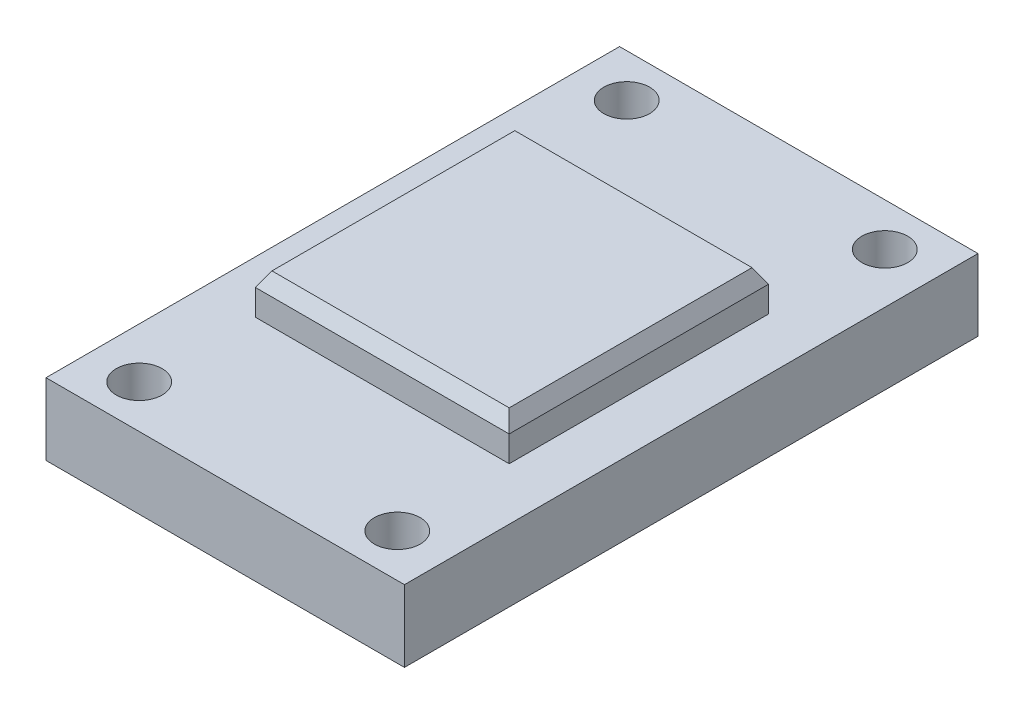
ISO-10303-21;
HEADER;
FILE_DESCRIPTION(('STEP AP214'),'2;1');
FILE_NAME('part.step','',(''),(''),'','','');
FILE_SCHEMA(('AUTOMOTIVE_DESIGN { 1 0 10303 214 1 1 1 1 }'));
ENDSEC;
DATA;
#1=APPLICATION_CONTEXT('core data for automotive mechanical design processes');
#2=APPLICATION_PROTOCOL_DEFINITION('international standard','automotive_design',2000,#1);
#3=PRODUCT_CONTEXT('',#1,'mechanical');
#4=PRODUCT('Part','Part','',(#3));
#5=PRODUCT_RELATED_PRODUCT_CATEGORY('part','',(#4));
#6=PRODUCT_DEFINITION_FORMATION('','',#4);
#7=PRODUCT_DEFINITION_CONTEXT('part definition',#1,'design');
#8=PRODUCT_DEFINITION('design','',#6,#7);
#9=PRODUCT_DEFINITION_SHAPE('','',#8);
#10=(LENGTH_UNIT() NAMED_UNIT(*) SI_UNIT(.MILLI.,.METRE.));
#11=(NAMED_UNIT(*) PLANE_ANGLE_UNIT() SI_UNIT($,.RADIAN.));
#12=(NAMED_UNIT(*) SI_UNIT($,.STERADIAN.) SOLID_ANGLE_UNIT());
#13=UNCERTAINTY_MEASURE_WITH_UNIT(LENGTH_MEASURE(1.E-05),#10,'distance_accuracy_value','');
#14=(GEOMETRIC_REPRESENTATION_CONTEXT(3) GLOBAL_UNCERTAINTY_ASSIGNED_CONTEXT((#13)) GLOBAL_UNIT_ASSIGNED_CONTEXT((#10,
#11,#12)) REPRESENTATION_CONTEXT('',''));
#15=CARTESIAN_POINT('',(0.,0.,0.));
#16=DIRECTION('',(0.,0.,1.));
#17=DIRECTION('',(1.,0.,0.));
#18=AXIS2_PLACEMENT_3D('',#15,#16,#17);
#19=CARTESIAN_POINT('',(0.,5.,0.));
#20=DIRECTION('',(0.,1.,0.));
#21=DIRECTION('',(0.,0.,1.));
#22=AXIS2_PLACEMENT_3D('',#19,#20,#21);
#23=PLANE('',#22);
#24=CARTESIAN_POINT('',(-9.,5.,17.));
#25=DIRECTION('',(0.,1.,0.));
#26=DIRECTION('',(0.,0.,1.));
#27=AXIS2_PLACEMENT_3D('',#24,#25,#26);
#28=CIRCLE('',#27,1.6);
#29=CARTESIAN_POINT('',(-9.,5.,18.6));
#30=VERTEX_POINT('',#29);
#31=EDGE_CURVE('E214',#30,#30,#28,.T.);
#32=ORIENTED_EDGE('',*,*,#31,.F.);
#33=EDGE_LOOP('',(#32));
#34=FACE_BOUND('',#33,.T.);
#35=CARTESIAN_POINT('',(-9.,5.,-17.));
#36=DIRECTION('',(0.,1.,0.));
#37=DIRECTION('',(0.,0.,1.));
#38=AXIS2_PLACEMENT_3D('',#35,#36,#37);
#39=CIRCLE('',#38,1.6);
#40=CARTESIAN_POINT('',(-9.,5.,-15.4));
#41=VERTEX_POINT('',#40);
#42=EDGE_CURVE('E211',#41,#41,#39,.T.);
#43=ORIENTED_EDGE('',*,*,#42,.F.);
#44=EDGE_LOOP('',(#43));
#45=FACE_BOUND('',#44,.T.);
#46=CARTESIAN_POINT('',(8.99999999999999,5.,-17.));
#47=DIRECTION('',(0.,1.,0.));
#48=DIRECTION('',(0.,0.,1.));
#49=AXIS2_PLACEMENT_3D('',#46,#47,#48);
#50=CIRCLE('',#49,1.6);
#51=CARTESIAN_POINT('',(8.99999999999999,5.,-15.4));
#52=VERTEX_POINT('',#51);
#53=EDGE_CURVE('E208',#52,#52,#50,.T.);
#54=ORIENTED_EDGE('',*,*,#53,.F.);
#55=EDGE_LOOP('',(#54));
#56=FACE_BOUND('',#55,.T.);
#57=CARTESIAN_POINT('',(9.,5.,17.));
#58=DIRECTION('',(0.,1.,0.));
#59=DIRECTION('',(0.,0.,1.));
#60=AXIS2_PLACEMENT_3D('',#57,#58,#59);
#61=CIRCLE('',#60,1.6);
#62=CARTESIAN_POINT('',(9.,5.,18.6));
#63=VERTEX_POINT('',#62);
#64=EDGE_CURVE('E126',#63,#63,#61,.T.);
#65=ORIENTED_EDGE('',*,*,#64,.F.);
#66=EDGE_LOOP('',(#65));
#67=FACE_BOUND('',#66,.T.);
#68=DIRECTION('',(0.,0.,1.));
#69=VECTOR('',#68,1.);
#70=CARTESIAN_POINT('',(-12.5,5.,20.));
#71=LINE('',#70,#69);
#72=CARTESIAN_POINT('',(-12.5,5.,-20.));
#73=VERTEX_POINT('',#72);
#74=CARTESIAN_POINT('',(-12.5,5.,20.));
#75=VERTEX_POINT('',#74);
#76=EDGE_CURVE('E140',#73,#75,#71,.T.);
#77=ORIENTED_EDGE('',*,*,#76,.T.);
#78=DIRECTION('',(1.,0.,0.));
#79=VECTOR('',#78,1.);
#80=CARTESIAN_POINT('',(12.5,5.,20.));
#81=LINE('',#80,#79);
#82=CARTESIAN_POINT('',(12.5,5.,20.));
#83=VERTEX_POINT('',#82);
#84=EDGE_CURVE('E143',#75,#83,#81,.T.);
#85=ORIENTED_EDGE('',*,*,#84,.T.);
#86=DIRECTION('',(0.,0.,-1.));
#87=VECTOR('',#86,1.);
#88=CARTESIAN_POINT('',(12.5,5.,20.));
#89=LINE('',#88,#87);
#90=CARTESIAN_POINT('',(12.5,5.,-20.));
#91=VERTEX_POINT('',#90);
#92=EDGE_CURVE('E146',#83,#91,#89,.T.);
#93=ORIENTED_EDGE('',*,*,#92,.T.);
#94=DIRECTION('',(-1.,0.,0.));
#95=VECTOR('',#94,1.);
#96=CARTESIAN_POINT('',(12.5,5.,-20.));
#97=LINE('',#96,#95);
#98=EDGE_CURVE('E148',#91,#73,#97,.T.);
#99=ORIENTED_EDGE('',*,*,#98,.T.);
#100=EDGE_LOOP('',(#77,#85,#93,#99));
#101=FACE_BOUND('',#100,.T.);
#102=DIRECTION('',(1.,0.,0.));
#103=VECTOR('',#102,1.);
#104=CARTESIAN_POINT('',(8.85,5.,9.04633934668198));
#105=LINE('',#104,#103);
#106=CARTESIAN_POINT('',(-8.84999999999999,5.,9.04633934668198));
#107=VERTEX_POINT('',#106);
#108=CARTESIAN_POINT('',(8.85,5.,9.04633934668198));
#109=VERTEX_POINT('',#108);
#110=EDGE_CURVE('E114',#107,#109,#105,.T.);
#111=ORIENTED_EDGE('',*,*,#110,.F.);
#112=DIRECTION('',(0.,0.,1.));
#113=VECTOR('',#112,1.);
#114=CARTESIAN_POINT('',(-8.85,5.,-9.04633934668197));
#115=LINE('',#114,#113);
#116=CARTESIAN_POINT('',(-8.85,5.,-9.04633934668197));
#117=VERTEX_POINT('',#116);
#118=EDGE_CURVE('E120',#117,#107,#115,.T.);
#119=ORIENTED_EDGE('',*,*,#118,.F.);
#120=DIRECTION('',(-1.,0.,0.));
#121=VECTOR('',#120,1.);
#122=CARTESIAN_POINT('',(8.85,5.,-9.04633934668198));
#123=LINE('',#122,#121);
#124=CARTESIAN_POINT('',(8.85,5.,-9.04633934668198));
#125=VERTEX_POINT('',#124);
#126=EDGE_CURVE('E131',#125,#117,#123,.T.);
#127=ORIENTED_EDGE('',*,*,#126,.F.);
#128=DIRECTION('',(0.,0.,-1.));
#129=VECTOR('',#128,1.);
#130=CARTESIAN_POINT('',(8.85,5.,-9.04633934668198));
#131=LINE('',#130,#129);
#132=EDGE_CURVE('E129',#109,#125,#131,.T.);
#133=ORIENTED_EDGE('',*,*,#132,.F.);
#134=EDGE_LOOP('',(#111,#119,#127,#133));
#135=FACE_BOUND('',#134,.T.);
#136=ADVANCED_FACE('F35',(#34,#45,#56,#67,#101,#135),#23,.T.);
#137=CARTESIAN_POINT('',(-12.5,5.,20.));
#138=DIRECTION('',(1.,0.,0.));
#139=DIRECTION('',(0.,0.,-1.));
#140=AXIS2_PLACEMENT_3D('',#137,#138,#139);
#141=PLANE('',#140);
#142=DIRECTION('',(0.,0.,1.));
#143=VECTOR('',#142,1.);
#144=CARTESIAN_POINT('',(-12.5,0.,20.));
#145=LINE('',#144,#143);
#146=CARTESIAN_POINT('',(-12.5,0.,-20.));
#147=VERTEX_POINT('',#146);
#148=CARTESIAN_POINT('',(-12.5,0.,20.));
#149=VERTEX_POINT('',#148);
#150=EDGE_CURVE('E116',#147,#149,#145,.T.);
#151=ORIENTED_EDGE('',*,*,#150,.T.);
#152=DIRECTION('',(0.,-1.,0.));
#153=VECTOR('',#152,1.);
#154=CARTESIAN_POINT('',(-12.5,5.,20.));
#155=LINE('',#154,#153);
#156=EDGE_CURVE('E166',#75,#149,#155,.T.);
#157=ORIENTED_EDGE('',*,*,#156,.F.);
#158=ORIENTED_EDGE('',*,*,#76,.F.);
#159=DIRECTION('',(0.,-1.,0.));
#160=VECTOR('',#159,1.);
#161=CARTESIAN_POINT('',(-12.5,5.,-20.));
#162=LINE('',#161,#160);
#163=EDGE_CURVE('E150',#73,#147,#162,.T.);
#164=ORIENTED_EDGE('',*,*,#163,.T.);
#165=EDGE_LOOP('',(#151,#157,#158,#164));
#166=FACE_BOUND('',#165,.T.);
#167=ADVANCED_FACE('F227',(#166),#141,.F.);
#168=CARTESIAN_POINT('',(12.5,5.,20.));
#169=DIRECTION('',(0.,0.,-1.));
#170=DIRECTION('',(-1.,0.,0.));
#171=AXIS2_PLACEMENT_3D('',#168,#169,#170);
#172=PLANE('',#171);
#173=DIRECTION('',(1.,0.,0.));
#174=VECTOR('',#173,1.);
#175=CARTESIAN_POINT('',(12.5,0.,20.));
#176=LINE('',#175,#174);
#177=CARTESIAN_POINT('',(12.5,0.,20.));
#178=VERTEX_POINT('',#177);
#179=EDGE_CURVE('E153',#149,#178,#176,.T.);
#180=ORIENTED_EDGE('',*,*,#179,.T.);
#181=DIRECTION('',(0.,-1.,0.));
#182=VECTOR('',#181,1.);
#183=CARTESIAN_POINT('',(12.5,5.,20.));
#184=LINE('',#183,#182);
#185=EDGE_CURVE('E163',#83,#178,#184,.T.);
#186=ORIENTED_EDGE('',*,*,#185,.F.);
#187=ORIENTED_EDGE('',*,*,#84,.F.);
#188=ORIENTED_EDGE('',*,*,#156,.T.);
#189=EDGE_LOOP('',(#180,#186,#187,#188));
#190=FACE_BOUND('',#189,.T.);
#191=ADVANCED_FACE('F238',(#190),#172,.F.);
#192=CARTESIAN_POINT('',(12.5,5.,20.));
#193=DIRECTION('',(-1.,0.,0.));
#194=DIRECTION('',(0.,0.,1.));
#195=AXIS2_PLACEMENT_3D('',#192,#193,#194);
#196=PLANE('',#195);
#197=DIRECTION('',(0.,0.,-1.));
#198=VECTOR('',#197,1.);
#199=CARTESIAN_POINT('',(12.5,0.,20.));
#200=LINE('',#199,#198);
#201=CARTESIAN_POINT('',(12.5,0.,-20.));
#202=VERTEX_POINT('',#201);
#203=EDGE_CURVE('E155',#178,#202,#200,.T.);
#204=ORIENTED_EDGE('',*,*,#203,.T.);
#205=DIRECTION('',(0.,-1.,0.));
#206=VECTOR('',#205,1.);
#207=CARTESIAN_POINT('',(12.5,5.,-20.));
#208=LINE('',#207,#206);
#209=EDGE_CURVE('E160',#91,#202,#208,.T.);
#210=ORIENTED_EDGE('',*,*,#209,.F.);
#211=ORIENTED_EDGE('',*,*,#92,.F.);
#212=ORIENTED_EDGE('',*,*,#185,.T.);
#213=EDGE_LOOP('',(#204,#210,#211,#212));
#214=FACE_BOUND('',#213,.T.);
#215=ADVANCED_FACE('F243',(#214),#196,.F.);
#216=CARTESIAN_POINT('',(12.5,5.,-20.));
#217=DIRECTION('',(0.,0.,1.));
#218=DIRECTION('',(1.,0.,0.));
#219=AXIS2_PLACEMENT_3D('',#216,#217,#218);
#220=PLANE('',#219);
#221=DIRECTION('',(-1.,0.,0.));
#222=VECTOR('',#221,1.);
#223=CARTESIAN_POINT('',(12.5,0.,-20.));
#224=LINE('',#223,#222);
#225=EDGE_CURVE('E144',#202,#147,#224,.T.);
#226=ORIENTED_EDGE('',*,*,#225,.T.);
#227=ORIENTED_EDGE('',*,*,#163,.F.);
#228=ORIENTED_EDGE('',*,*,#98,.F.);
#229=ORIENTED_EDGE('',*,*,#209,.T.);
#230=EDGE_LOOP('',(#226,#227,#228,#229));
#231=FACE_BOUND('',#230,.T.);
#232=ADVANCED_FACE('F246',(#231),#220,.F.);
#233=CARTESIAN_POINT('',(0.,0.,0.));
#234=DIRECTION('',(0.,1.,0.));
#235=DIRECTION('',(0.,0.,1.));
#236=AXIS2_PLACEMENT_3D('',#233,#234,#235);
#237=PLANE('',#236);
#238=CARTESIAN_POINT('',(-9.,0.,17.));
#239=DIRECTION('',(0.,1.,0.));
#240=DIRECTION('',(0.,0.,1.));
#241=AXIS2_PLACEMENT_3D('',#238,#239,#240);
#242=CIRCLE('',#241,1.6);
#243=CARTESIAN_POINT('',(-9.,0.,18.6));
#244=VERTEX_POINT('',#243);
#245=EDGE_CURVE('E204',#244,#244,#242,.T.);
#246=ORIENTED_EDGE('',*,*,#245,.T.);
#247=EDGE_LOOP('',(#246));
#248=FACE_BOUND('',#247,.T.);
#249=CARTESIAN_POINT('',(-9.,0.,-17.));
#250=DIRECTION('',(0.,1.,0.));
#251=DIRECTION('',(0.,0.,1.));
#252=AXIS2_PLACEMENT_3D('',#249,#250,#251);
#253=CIRCLE('',#252,1.6);
#254=CARTESIAN_POINT('',(-9.,0.,-15.4));
#255=VERTEX_POINT('',#254);
#256=EDGE_CURVE('E199',#255,#255,#253,.T.);
#257=ORIENTED_EDGE('',*,*,#256,.T.);
#258=EDGE_LOOP('',(#257));
#259=FACE_BOUND('',#258,.T.);
#260=CARTESIAN_POINT('',(8.99999999999999,0.,-17.));
#261=DIRECTION('',(0.,1.,0.));
#262=DIRECTION('',(0.,0.,1.));
#263=AXIS2_PLACEMENT_3D('',#260,#261,#262);
#264=CIRCLE('',#263,1.6);
#265=CARTESIAN_POINT('',(8.99999999999999,0.,-15.4));
#266=VERTEX_POINT('',#265);
#267=EDGE_CURVE('E194',#266,#266,#264,.T.);
#268=ORIENTED_EDGE('',*,*,#267,.T.);
#269=EDGE_LOOP('',(#268));
#270=FACE_BOUND('',#269,.T.);
#271=CARTESIAN_POINT('',(9.,0.,17.));
#272=DIRECTION('',(0.,1.,0.));
#273=DIRECTION('',(0.,0.,1.));
#274=AXIS2_PLACEMENT_3D('',#271,#272,#273);
#275=CIRCLE('',#274,1.6);
#276=CARTESIAN_POINT('',(9.,0.,18.6));
#277=VERTEX_POINT('',#276);
#278=EDGE_CURVE('E217',#277,#277,#275,.T.);
#279=ORIENTED_EDGE('',*,*,#278,.T.);
#280=EDGE_LOOP('',(#279));
#281=FACE_BOUND('',#280,.T.);
#282=ORIENTED_EDGE('',*,*,#150,.F.);
#283=ORIENTED_EDGE('',*,*,#225,.F.);
#284=ORIENTED_EDGE('',*,*,#203,.F.);
#285=ORIENTED_EDGE('',*,*,#179,.F.);
#286=EDGE_LOOP('',(#282,#283,#284,#285));
#287=FACE_BOUND('',#286,.T.);
#288=ADVANCED_FACE('F248',(#248,#259,#270,#281,#287),#237,.F.);
#289=CARTESIAN_POINT('',(-8.85,7.8,-9.04633934668197));
#290=DIRECTION('',(1.,0.,0.));
#291=DIRECTION('',(0.,0.,-1.));
#292=AXIS2_PLACEMENT_3D('',#289,#290,#291);
#293=PLANE('',#292);
#294=DIRECTION('',(0.,-1.,0.));
#295=VECTOR('',#294,1.);
#296=CARTESIAN_POINT('',(-8.84999999999999,7.8,9.04633934668198));
#297=LINE('',#296,#295);
#298=CARTESIAN_POINT('',(-8.84999999999999,6.79999999999999,9.04633934668198));
#299=VERTEX_POINT('',#298);
#300=EDGE_CURVE('E110',#299,#107,#297,.T.);
#301=ORIENTED_EDGE('',*,*,#300,.F.);
#302=DIRECTION('',(0.,0.,-1.));
#303=VECTOR('',#302,1.);
#304=CARTESIAN_POINT('',(-8.85,6.79999999999999,-9.04633934668197));
#305=LINE('',#304,#303);
#306=CARTESIAN_POINT('',(-8.85,6.79999999999999,-9.04633934668197));
#307=VERTEX_POINT('',#306);
#308=EDGE_CURVE('E44',#299,#307,#305,.T.);
#309=ORIENTED_EDGE('',*,*,#308,.T.);
#310=DIRECTION('',(0.,-1.,0.));
#311=VECTOR('',#310,1.);
#312=CARTESIAN_POINT('',(-8.85,7.8,-9.04633934668197));
#313=LINE('',#312,#311);
#314=EDGE_CURVE('E122',#307,#117,#313,.T.);
#315=ORIENTED_EDGE('',*,*,#314,.T.);
#316=ORIENTED_EDGE('',*,*,#118,.T.);
#317=EDGE_LOOP('',(#301,#309,#315,#316));
#318=FACE_BOUND('',#317,.T.);
#319=ADVANCED_FACE('F121',(#318),#293,.F.);
#320=CARTESIAN_POINT('',(8.85,7.8,9.04633934668198));
#321=DIRECTION('',(0.,0.,-1.));
#322=DIRECTION('',(-1.,0.,0.));
#323=AXIS2_PLACEMENT_3D('',#320,#321,#322);
#324=PLANE('',#323);
#325=DIRECTION('',(0.,-1.,0.));
#326=VECTOR('',#325,1.);
#327=CARTESIAN_POINT('',(8.85,7.8,9.04633934668198));
#328=LINE('',#327,#326);
#329=CARTESIAN_POINT('',(8.85,6.79999999999999,9.04633934668198));
#330=VERTEX_POINT('',#329);
#331=EDGE_CURVE('E117',#330,#109,#328,.T.);
#332=ORIENTED_EDGE('',*,*,#331,.F.);
#333=DIRECTION('',(-1.,0.,0.));
#334=VECTOR('',#333,1.);
#335=CARTESIAN_POINT('',(8.85,6.79999999999999,9.04633934668198));
#336=LINE('',#335,#334);
#337=EDGE_CURVE('E11',#330,#299,#336,.T.);
#338=ORIENTED_EDGE('',*,*,#337,.T.);
#339=ORIENTED_EDGE('',*,*,#300,.T.);
#340=ORIENTED_EDGE('',*,*,#110,.T.);
#341=EDGE_LOOP('',(#332,#338,#339,#340));
#342=FACE_BOUND('',#341,.T.);
#343=ADVANCED_FACE('F112',(#342),#324,.F.);
#344=CARTESIAN_POINT('',(8.85,7.8,-9.04633934668198));
#345=DIRECTION('',(-1.,0.,0.));
#346=DIRECTION('',(0.,0.,1.));
#347=AXIS2_PLACEMENT_3D('',#344,#345,#346);
#348=PLANE('',#347);
#349=DIRECTION('',(0.,-1.,0.));
#350=VECTOR('',#349,1.);
#351=CARTESIAN_POINT('',(8.85,7.8,-9.04633934668198));
#352=LINE('',#351,#350);
#353=CARTESIAN_POINT('',(8.85,6.79999999999999,-9.04633934668198));
#354=VERTEX_POINT('',#353);
#355=EDGE_CURVE('E137',#354,#125,#352,.T.);
#356=ORIENTED_EDGE('',*,*,#355,.F.);
#357=DIRECTION('',(0.,0.,1.));
#358=VECTOR('',#357,1.);
#359=CARTESIAN_POINT('',(8.85,6.79999999999999,-9.04633934668198));
#360=LINE('',#359,#358);
#361=EDGE_CURVE('E178',#354,#330,#360,.T.);
#362=ORIENTED_EDGE('',*,*,#361,.T.);
#363=ORIENTED_EDGE('',*,*,#331,.T.);
#364=ORIENTED_EDGE('',*,*,#132,.T.);
#365=EDGE_LOOP('',(#356,#362,#363,#364));
#366=FACE_BOUND('',#365,.T.);
#367=ADVANCED_FACE('F293',(#366),#348,.F.);
#368=CARTESIAN_POINT('',(8.85,7.8,-9.04633934668198));
#369=DIRECTION('',(0.,0.,1.));
#370=DIRECTION('',(1.,0.,0.));
#371=AXIS2_PLACEMENT_3D('',#368,#369,#370);
#372=PLANE('',#371);
#373=ORIENTED_EDGE('',*,*,#314,.F.);
#374=DIRECTION('',(1.,0.,0.));
#375=VECTOR('',#374,1.);
#376=CARTESIAN_POINT('',(8.85,6.79999999999999,-9.04633934668198));
#377=LINE('',#376,#375);
#378=EDGE_CURVE('E181',#307,#354,#377,.T.);
#379=ORIENTED_EDGE('',*,*,#378,.T.);
#380=ORIENTED_EDGE('',*,*,#355,.T.);
#381=ORIENTED_EDGE('',*,*,#126,.T.);
#382=EDGE_LOOP('',(#373,#379,#380,#381));
#383=FACE_BOUND('',#382,.T.);
#384=ADVANCED_FACE('F290',(#383),#372,.F.);
#385=CARTESIAN_POINT('',(0.,7.8,0.));
#386=DIRECTION('',(0.,-1.,0.));
#387=DIRECTION('',(0.,0.,-1.));
#388=AXIS2_PLACEMENT_3D('',#385,#386,#387);
#389=PLANE('',#388);
#390=DIRECTION('',(1.,0.,0.));
#391=VECTOR('',#390,1.);
#392=CARTESIAN_POINT('',(0.,7.8,8.46898907749235));
#393=LINE('',#392,#391);
#394=CARTESIAN_POINT('',(-8.27264973081036,7.8,8.46898907749235));
#395=VERTEX_POINT('',#394);
#396=CARTESIAN_POINT('',(8.27264973081038,7.8,8.46898907749235));
#397=VERTEX_POINT('',#396);
#398=EDGE_CURVE('E169',#395,#397,#393,.T.);
#399=ORIENTED_EDGE('',*,*,#398,.T.);
#400=DIRECTION('',(0.,0.,-1.));
#401=VECTOR('',#400,1.);
#402=CARTESIAN_POINT('',(8.27264973081037,7.8,0.));
#403=LINE('',#402,#401);
#404=CARTESIAN_POINT('',(8.27264973081037,7.8,-8.46898907749235));
#405=VERTEX_POINT('',#404);
#406=EDGE_CURVE('E175',#397,#405,#403,.T.);
#407=ORIENTED_EDGE('',*,*,#406,.T.);
#408=DIRECTION('',(-1.,0.,0.));
#409=VECTOR('',#408,1.);
#410=CARTESIAN_POINT('',(0.,7.8,-8.46898907749234));
#411=LINE('',#410,#409);
#412=CARTESIAN_POINT('',(-8.27264973081037,7.8,-8.46898907749234));
#413=VERTEX_POINT('',#412);
#414=EDGE_CURVE('E173',#405,#413,#411,.T.);
#415=ORIENTED_EDGE('',*,*,#414,.T.);
#416=DIRECTION('',(0.,0.,1.));
#417=VECTOR('',#416,1.);
#418=CARTESIAN_POINT('',(-8.27264973081037,7.8,0.));
#419=LINE('',#418,#417);
#420=EDGE_CURVE('E171',#413,#395,#419,.T.);
#421=ORIENTED_EDGE('',*,*,#420,.T.);
#422=EDGE_LOOP('',(#399,#407,#415,#421));
#423=FACE_BOUND('',#422,.T.);
#424=ADVANCED_FACE('F297',(#423),#389,.F.);
#425=CARTESIAN_POINT('',(9.,0.,17.));
#426=DIRECTION('',(0.,1.,0.));
#427=DIRECTION('',(0.,0.,1.));
#428=AXIS2_PLACEMENT_3D('',#425,#426,#427);
#429=CYLINDRICAL_SURFACE('',#428,1.6);
#430=ORIENTED_EDGE('',*,*,#64,.T.);
#431=EDGE_LOOP('',(#430));
#432=FACE_BOUND('',#431,.T.);
#433=ORIENTED_EDGE('',*,*,#278,.F.);
#434=EDGE_LOOP('',(#433));
#435=FACE_BOUND('',#434,.T.);
#436=ADVANCED_FACE('F222',(#432,#435),#429,.F.);
#437=CARTESIAN_POINT('',(8.99999999999999,0.,-17.));
#438=DIRECTION('',(0.,1.,0.));
#439=DIRECTION('',(0.,0.,1.));
#440=AXIS2_PLACEMENT_3D('',#437,#438,#439);
#441=CYLINDRICAL_SURFACE('',#440,1.6);
#442=ORIENTED_EDGE('',*,*,#53,.T.);
#443=EDGE_LOOP('',(#442));
#444=FACE_BOUND('',#443,.T.);
#445=ORIENTED_EDGE('',*,*,#267,.F.);
#446=EDGE_LOOP('',(#445));
#447=FACE_BOUND('',#446,.T.);
#448=ADVANCED_FACE('F304',(#444,#447),#441,.F.);
#449=CARTESIAN_POINT('',(-9.,0.,-17.));
#450=DIRECTION('',(0.,1.,0.));
#451=DIRECTION('',(0.,0.,1.));
#452=AXIS2_PLACEMENT_3D('',#449,#450,#451);
#453=CYLINDRICAL_SURFACE('',#452,1.6);
#454=ORIENTED_EDGE('',*,*,#42,.T.);
#455=EDGE_LOOP('',(#454));
#456=FACE_BOUND('',#455,.T.);
#457=ORIENTED_EDGE('',*,*,#256,.F.);
#458=EDGE_LOOP('',(#457));
#459=FACE_BOUND('',#458,.T.);
#460=ADVANCED_FACE('F283',(#456,#459),#453,.F.);
#461=CARTESIAN_POINT('',(-9.,0.,17.));
#462=DIRECTION('',(0.,1.,0.));
#463=DIRECTION('',(0.,0.,1.));
#464=AXIS2_PLACEMENT_3D('',#461,#462,#463);
#465=CYLINDRICAL_SURFACE('',#464,1.6);
#466=ORIENTED_EDGE('',*,*,#31,.T.);
#467=EDGE_LOOP('',(#466));
#468=FACE_BOUND('',#467,.T.);
#469=ORIENTED_EDGE('',*,*,#245,.F.);
#470=EDGE_LOOP('',(#469));
#471=FACE_BOUND('',#470,.T.);
#472=ADVANCED_FACE('F278',(#468,#471),#465,.F.);
#473=CARTESIAN_POINT('',(-8.27264973081037,7.8,0.));
#474=DIRECTION('',(0.866025403784439,-0.499999999999999,0.));
#475=DIRECTION('',(0.,0.,1.));
#476=AXIS2_PLACEMENT_3D('',#473,#474,#475);
#477=PLANE('',#476);
#478=DIRECTION('',(-0.447213595499957,-0.774596669241484,-0.447213595499958));
#479=VECTOR('',#478,1.);
#480=CARTESIAN_POINT('',(-6.5788519153119,10.7337438741925,-6.77519126199387));
#481=LINE('',#480,#479);
#482=EDGE_CURVE('E187',#307,#413,#481,.F.);
#483=ORIENTED_EDGE('',*,*,#482,.F.);
#484=ORIENTED_EDGE('',*,*,#308,.F.);
#485=DIRECTION('',(-0.447213595499957,-0.774596669241484,0.447213595499958));
#486=VECTOR('',#485,1.);
#487=CARTESIAN_POINT('',(-6.6181197846483,10.6657299293969,6.81445913133028));
#488=LINE('',#487,#486);
#489=EDGE_CURVE('E39',#395,#299,#488,.T.);
#490=ORIENTED_EDGE('',*,*,#489,.F.);
#491=ORIENTED_EDGE('',*,*,#420,.F.);
#492=EDGE_LOOP('',(#483,#484,#490,#491));
#493=FACE_BOUND('',#492,.T.);
#494=ADVANCED_FACE('F37',(#493),#477,.F.);
#495=CARTESIAN_POINT('',(0.,7.8,8.46898907749235));
#496=DIRECTION('',(0.,-0.5,-0.866025403784439));
#497=DIRECTION('',(1.,0.,0.));
#498=AXIS2_PLACEMENT_3D('',#495,#496,#497);
#499=PLANE('',#498);
#500=ORIENTED_EDGE('',*,*,#489,.T.);
#501=ORIENTED_EDGE('',*,*,#337,.F.);
#502=DIRECTION('',(-0.447213595499958,0.774596669241484,-0.447213595499958));
#503=VECTOR('',#502,1.);
#504=CARTESIAN_POINT('',(6.6181197846483,10.6657299293969,6.81445913133027));
#505=LINE('',#504,#503);
#506=EDGE_CURVE('E186',#397,#330,#505,.F.);
#507=ORIENTED_EDGE('',*,*,#506,.F.);
#508=ORIENTED_EDGE('',*,*,#398,.F.);
#509=EDGE_LOOP('',(#500,#501,#507,#508));
#510=FACE_BOUND('',#509,.T.);
#511=ADVANCED_FACE('F273',(#510),#499,.F.);
#512=CARTESIAN_POINT('',(0.,7.8,-8.46898907749234));
#513=DIRECTION('',(0.,-0.5,0.866025403784439));
#514=DIRECTION('',(-1.,0.,0.));
#515=AXIS2_PLACEMENT_3D('',#512,#513,#514);
#516=PLANE('',#515);
#517=ORIENTED_EDGE('',*,*,#482,.T.);
#518=ORIENTED_EDGE('',*,*,#414,.F.);
#519=DIRECTION('',(0.447213595499958,-0.774596669241484,-0.447213595499958));
#520=VECTOR('',#519,1.);
#521=CARTESIAN_POINT('',(6.6181197846483,10.6657299293969,-6.81445913133027));
#522=LINE('',#521,#520);
#523=EDGE_CURVE('E184',#354,#405,#522,.F.);
#524=ORIENTED_EDGE('',*,*,#523,.F.);
#525=ORIENTED_EDGE('',*,*,#378,.F.);
#526=EDGE_LOOP('',(#517,#518,#524,#525));
#527=FACE_BOUND('',#526,.T.);
#528=ADVANCED_FACE('F270',(#527),#516,.F.);
#529=CARTESIAN_POINT('',(8.27264973081037,7.8,0.));
#530=DIRECTION('',(-0.866025403784439,-0.5,0.));
#531=DIRECTION('',(0.,0.,-1.));
#532=AXIS2_PLACEMENT_3D('',#529,#530,#531);
#533=PLANE('',#532);
#534=ORIENTED_EDGE('',*,*,#506,.T.);
#535=ORIENTED_EDGE('',*,*,#361,.F.);
#536=ORIENTED_EDGE('',*,*,#523,.T.);
#537=ORIENTED_EDGE('',*,*,#406,.F.);
#538=EDGE_LOOP('',(#534,#535,#536,#537));
#539=FACE_BOUND('',#538,.T.);
#540=ADVANCED_FACE('F267',(#539),#533,.F.);
#541=CLOSED_SHELL('',(#136,#167,#191,#215,#232,#288,#319,#343,#367,#384,#424,#436,#448,#460,
#472,#494,#511,#528,#540));
#542=MANIFOLD_SOLID_BREP('B2',#541);
#543=ADVANCED_BREP_SHAPE_REPRESENTATION('',(#18,#542),#14);
#544=SHAPE_DEFINITION_REPRESENTATION(#9,#543);
ENDSEC;
END-ISO-10303-21;
